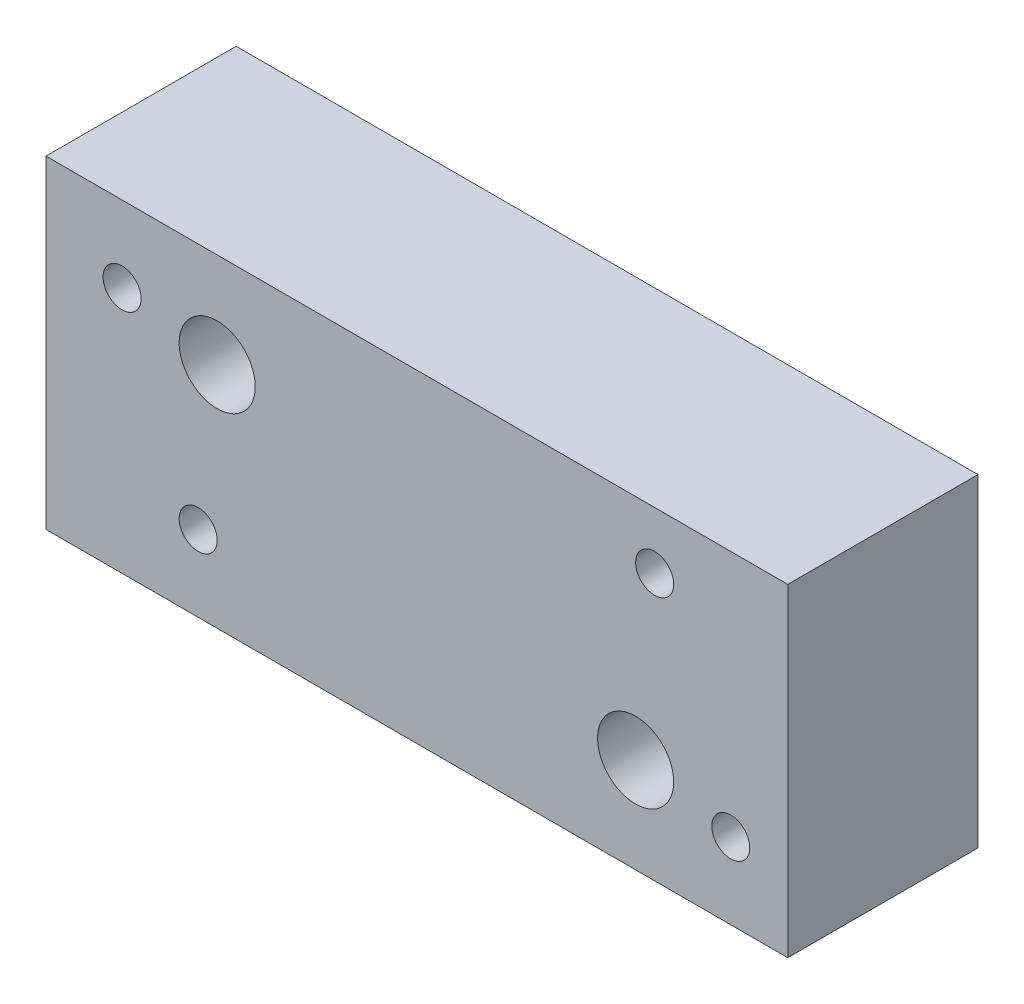
ISO-10303-21;
HEADER;
FILE_DESCRIPTION(('STEP AP214'),'2;1');
FILE_NAME('part.step','',(''),(''),'','','');
FILE_SCHEMA(('AUTOMOTIVE_DESIGN { 1 0 10303 214 1 1 1 1 }'));
ENDSEC;
DATA;
#1=APPLICATION_CONTEXT('core data for automotive mechanical design processes');
#2=APPLICATION_PROTOCOL_DEFINITION('international standard','automotive_design',2000,#1);
#3=PRODUCT_CONTEXT('',#1,'mechanical');
#4=PRODUCT('Part','Part','',(#3));
#5=PRODUCT_RELATED_PRODUCT_CATEGORY('part','',(#4));
#6=PRODUCT_DEFINITION_FORMATION('','',#4);
#7=PRODUCT_DEFINITION_CONTEXT('part definition',#1,'design');
#8=PRODUCT_DEFINITION('design','',#6,#7);
#9=PRODUCT_DEFINITION_SHAPE('','',#8);
#10=(LENGTH_UNIT() NAMED_UNIT(*) SI_UNIT(.MILLI.,.METRE.));
#11=(NAMED_UNIT(*) PLANE_ANGLE_UNIT() SI_UNIT($,.RADIAN.));
#12=(NAMED_UNIT(*) SI_UNIT($,.STERADIAN.) SOLID_ANGLE_UNIT());
#13=UNCERTAINTY_MEASURE_WITH_UNIT(LENGTH_MEASURE(1.E-05),#10,'distance_accuracy_value','');
#14=(GEOMETRIC_REPRESENTATION_CONTEXT(3) GLOBAL_UNCERTAINTY_ASSIGNED_CONTEXT((#13)) GLOBAL_UNIT_ASSIGNED_CONTEXT((#10,
#11,#12)) REPRESENTATION_CONTEXT('',''));
#15=CARTESIAN_POINT('',(0.,0.,0.));
#16=DIRECTION('',(0.,0.,1.));
#17=DIRECTION('',(1.,0.,0.));
#18=AXIS2_PLACEMENT_3D('',#15,#16,#17);
#19=CARTESIAN_POINT('',(0.,0.,5.));
#20=DIRECTION('',(0.,0.,1.));
#21=DIRECTION('',(1.,0.,0.));
#22=AXIS2_PLACEMENT_3D('',#19,#20,#21);
#23=PLANE('',#22);
#24=CARTESIAN_POINT('',(12.5,5.5,5.));
#25=DIRECTION('',(0.,0.,1.));
#26=DIRECTION('',(1.,0.,0.));
#27=AXIS2_PLACEMENT_3D('',#24,#25,#26);
#28=CIRCLE('',#27,1.);
#29=CARTESIAN_POINT('',(13.5,5.5,5.));
#30=VERTEX_POINT('',#29);
#31=EDGE_CURVE('E162',#30,#30,#28,.T.);
#32=ORIENTED_EDGE('',*,*,#31,.F.);
#33=EDGE_LOOP('',(#32));
#34=FACE_BOUND('',#33,.T.);
#35=CARTESIAN_POINT('',(-11.5,-4.5,5.));
#36=DIRECTION('',(0.,0.,1.));
#37=DIRECTION('',(1.,0.,0.));
#38=AXIS2_PLACEMENT_3D('',#35,#36,#37);
#39=CIRCLE('',#38,1.);
#40=CARTESIAN_POINT('',(-10.5,-4.5,5.));
#41=VERTEX_POINT('',#40);
#42=EDGE_CURVE('E146',#41,#41,#39,.T.);
#43=ORIENTED_EDGE('',*,*,#42,.F.);
#44=EDGE_LOOP('',(#43));
#45=FACE_BOUND('',#44,.T.);
#46=CARTESIAN_POINT('',(-10.5,3.5,5.));
#47=DIRECTION('',(0.,0.,1.));
#48=DIRECTION('',(1.,0.,0.));
#49=AXIS2_PLACEMENT_3D('',#46,#47,#48);
#50=CIRCLE('',#49,2.);
#51=CARTESIAN_POINT('',(-8.50000000000001,3.5,5.));
#52=VERTEX_POINT('',#51);
#53=EDGE_CURVE('E116',#52,#52,#50,.T.);
#54=ORIENTED_EDGE('',*,*,#53,.F.);
#55=EDGE_LOOP('',(#54));
#56=FACE_BOUND('',#55,.T.);
#57=DIRECTION('',(0.,-1.,0.));
#58=VECTOR('',#57,1.);
#59=CARTESIAN_POINT('',(-19.5,-8.5,5.));
#60=LINE('',#59,#58);
#61=CARTESIAN_POINT('',(-19.5,8.5,5.));
#62=VERTEX_POINT('',#61);
#63=CARTESIAN_POINT('',(-19.5,-8.5,5.));
#64=VERTEX_POINT('',#63);
#65=EDGE_CURVE('E96',#62,#64,#60,.T.);
#66=ORIENTED_EDGE('',*,*,#65,.T.);
#67=DIRECTION('',(1.,0.,0.));
#68=VECTOR('',#67,1.);
#69=CARTESIAN_POINT('',(19.5,-8.5,5.));
#70=LINE('',#69,#68);
#71=CARTESIAN_POINT('',(19.5,-8.5,5.));
#72=VERTEX_POINT('',#71);
#73=EDGE_CURVE('E91',#64,#72,#70,.T.);
#74=ORIENTED_EDGE('',*,*,#73,.T.);
#75=DIRECTION('',(0.,1.,0.));
#76=VECTOR('',#75,1.);
#77=CARTESIAN_POINT('',(19.5,-8.5,5.));
#78=LINE('',#77,#76);
#79=CARTESIAN_POINT('',(19.5,8.5,5.));
#80=VERTEX_POINT('',#79);
#81=EDGE_CURVE('E94',#72,#80,#78,.T.);
#82=ORIENTED_EDGE('',*,*,#81,.T.);
#83=DIRECTION('',(-1.,0.,0.));
#84=VECTOR('',#83,1.);
#85=CARTESIAN_POINT('',(19.5,8.5,5.));
#86=LINE('',#85,#84);
#87=EDGE_CURVE('E61',#80,#62,#86,.T.);
#88=ORIENTED_EDGE('',*,*,#87,.T.);
#89=EDGE_LOOP('',(#66,#74,#82,#88));
#90=FACE_BOUND('',#89,.T.);
#91=CARTESIAN_POINT('',(-15.5,4.5,5.));
#92=DIRECTION('',(0.,0.,1.));
#93=DIRECTION('',(1.,0.,0.));
#94=AXIS2_PLACEMENT_3D('',#91,#92,#93);
#95=CIRCLE('',#94,1.);
#96=CARTESIAN_POINT('',(-14.5,4.5,5.));
#97=VERTEX_POINT('',#96);
#98=EDGE_CURVE('E138',#97,#97,#95,.T.);
#99=ORIENTED_EDGE('',*,*,#98,.F.);
#100=EDGE_LOOP('',(#99));
#101=FACE_BOUND('',#100,.T.);
#102=CARTESIAN_POINT('',(11.5,-3.5,5.));
#103=DIRECTION('',(0.,0.,1.));
#104=DIRECTION('',(1.,0.,0.));
#105=AXIS2_PLACEMENT_3D('',#102,#103,#104);
#106=CIRCLE('',#105,2.);
#107=CARTESIAN_POINT('',(13.5,-3.5,5.));
#108=VERTEX_POINT('',#107);
#109=EDGE_CURVE('E154',#108,#108,#106,.T.);
#110=ORIENTED_EDGE('',*,*,#109,.F.);
#111=EDGE_LOOP('',(#110));
#112=FACE_BOUND('',#111,.T.);
#113=CARTESIAN_POINT('',(16.5,-4.5,5.));
#114=DIRECTION('',(0.,0.,1.));
#115=DIRECTION('',(1.,0.,0.));
#116=AXIS2_PLACEMENT_3D('',#113,#114,#115);
#117=CIRCLE('',#116,1.);
#118=CARTESIAN_POINT('',(17.5,-4.5,5.));
#119=VERTEX_POINT('',#118);
#120=EDGE_CURVE('E170',#119,#119,#117,.T.);
#121=ORIENTED_EDGE('',*,*,#120,.F.);
#122=EDGE_LOOP('',(#121));
#123=FACE_BOUND('',#122,.T.);
#124=ADVANCED_FACE('F43',(#34,#45,#56,#90,#101,#112,#123),#23,.T.);
#125=CARTESIAN_POINT('',(0.,0.,-5.));
#126=DIRECTION('',(0.,0.,1.));
#127=DIRECTION('',(1.,0.,0.));
#128=AXIS2_PLACEMENT_3D('',#125,#126,#127);
#129=PLANE('',#128);
#130=DIRECTION('',(0.,-1.,0.));
#131=VECTOR('',#130,1.);
#132=CARTESIAN_POINT('',(-19.5,-8.5,-5.));
#133=LINE('',#132,#131);
#134=CARTESIAN_POINT('',(-19.5,8.5,-5.));
#135=VERTEX_POINT('',#134);
#136=CARTESIAN_POINT('',(-19.5,-8.5,-5.));
#137=VERTEX_POINT('',#136);
#138=EDGE_CURVE('E112',#135,#137,#133,.T.);
#139=ORIENTED_EDGE('',*,*,#138,.F.);
#140=DIRECTION('',(-1.,0.,0.));
#141=VECTOR('',#140,1.);
#142=CARTESIAN_POINT('',(19.5,8.5,-5.));
#143=LINE('',#142,#141);
#144=CARTESIAN_POINT('',(19.5,8.5,-5.));
#145=VERTEX_POINT('',#144);
#146=EDGE_CURVE('E84',#145,#135,#143,.T.);
#147=ORIENTED_EDGE('',*,*,#146,.F.);
#148=DIRECTION('',(0.,1.,0.));
#149=VECTOR('',#148,1.);
#150=CARTESIAN_POINT('',(19.5,-8.5,-5.));
#151=LINE('',#150,#149);
#152=CARTESIAN_POINT('',(19.5,-8.5,-5.));
#153=VERTEX_POINT('',#152);
#154=EDGE_CURVE('E78',#153,#145,#151,.T.);
#155=ORIENTED_EDGE('',*,*,#154,.F.);
#156=DIRECTION('',(1.,0.,0.));
#157=VECTOR('',#156,1.);
#158=CARTESIAN_POINT('',(19.5,-8.5,-5.));
#159=LINE('',#158,#157);
#160=EDGE_CURVE('E101',#137,#153,#159,.T.);
#161=ORIENTED_EDGE('',*,*,#160,.F.);
#162=EDGE_LOOP('',(#139,#147,#155,#161));
#163=FACE_BOUND('',#162,.T.);
#164=CARTESIAN_POINT('',(-10.5,3.5,-5.));
#165=DIRECTION('',(0.,0.,1.));
#166=DIRECTION('',(1.,0.,0.));
#167=AXIS2_PLACEMENT_3D('',#164,#165,#166);
#168=CIRCLE('',#167,2.);
#169=CARTESIAN_POINT('',(-8.50000000000001,3.5,-5.));
#170=VERTEX_POINT('',#169);
#171=EDGE_CURVE('E134',#170,#170,#168,.T.);
#172=ORIENTED_EDGE('',*,*,#171,.T.);
#173=EDGE_LOOP('',(#172));
#174=FACE_BOUND('',#173,.T.);
#175=CARTESIAN_POINT('',(-15.5,4.5,-5.));
#176=DIRECTION('',(0.,0.,1.));
#177=DIRECTION('',(1.,0.,0.));
#178=AXIS2_PLACEMENT_3D('',#175,#176,#177);
#179=CIRCLE('',#178,1.);
#180=CARTESIAN_POINT('',(-14.5,4.5,-5.));
#181=VERTEX_POINT('',#180);
#182=EDGE_CURVE('E142',#181,#181,#179,.T.);
#183=ORIENTED_EDGE('',*,*,#182,.T.);
#184=EDGE_LOOP('',(#183));
#185=FACE_BOUND('',#184,.T.);
#186=CARTESIAN_POINT('',(-11.5,-4.5,-5.));
#187=DIRECTION('',(0.,0.,1.));
#188=DIRECTION('',(1.,0.,0.));
#189=AXIS2_PLACEMENT_3D('',#186,#187,#188);
#190=CIRCLE('',#189,1.);
#191=CARTESIAN_POINT('',(-10.5,-4.5,-5.));
#192=VERTEX_POINT('',#191);
#193=EDGE_CURVE('E150',#192,#192,#190,.T.);
#194=ORIENTED_EDGE('',*,*,#193,.T.);
#195=EDGE_LOOP('',(#194));
#196=FACE_BOUND('',#195,.T.);
#197=CARTESIAN_POINT('',(11.5,-3.5,-5.));
#198=DIRECTION('',(0.,0.,1.));
#199=DIRECTION('',(1.,0.,0.));
#200=AXIS2_PLACEMENT_3D('',#197,#198,#199);
#201=CIRCLE('',#200,2.);
#202=CARTESIAN_POINT('',(13.5,-3.5,-5.));
#203=VERTEX_POINT('',#202);
#204=EDGE_CURVE('E158',#203,#203,#201,.T.);
#205=ORIENTED_EDGE('',*,*,#204,.T.);
#206=EDGE_LOOP('',(#205));
#207=FACE_BOUND('',#206,.T.);
#208=CARTESIAN_POINT('',(12.5,5.5,-5.));
#209=DIRECTION('',(0.,0.,1.));
#210=DIRECTION('',(1.,0.,0.));
#211=AXIS2_PLACEMENT_3D('',#208,#209,#210);
#212=CIRCLE('',#211,1.);
#213=CARTESIAN_POINT('',(13.5,5.5,-5.));
#214=VERTEX_POINT('',#213);
#215=EDGE_CURVE('E166',#214,#214,#212,.T.);
#216=ORIENTED_EDGE('',*,*,#215,.T.);
#217=EDGE_LOOP('',(#216));
#218=FACE_BOUND('',#217,.T.);
#219=CARTESIAN_POINT('',(16.5,-4.5,-5.));
#220=DIRECTION('',(0.,0.,1.));
#221=DIRECTION('',(1.,0.,0.));
#222=AXIS2_PLACEMENT_3D('',#219,#220,#221);
#223=CIRCLE('',#222,1.);
#224=CARTESIAN_POINT('',(17.5,-4.5,-5.));
#225=VERTEX_POINT('',#224);
#226=EDGE_CURVE('E174',#225,#225,#223,.T.);
#227=ORIENTED_EDGE('',*,*,#226,.T.);
#228=EDGE_LOOP('',(#227));
#229=FACE_BOUND('',#228,.T.);
#230=ADVANCED_FACE('F129',(#163,#174,#185,#196,#207,#218,#229),#129,.F.);
#231=CARTESIAN_POINT('',(-19.5,-8.5,5.));
#232=DIRECTION('',(1.,0.,0.));
#233=DIRECTION('',(0.,0.,-1.));
#234=AXIS2_PLACEMENT_3D('',#231,#232,#233);
#235=PLANE('',#234);
#236=ORIENTED_EDGE('',*,*,#138,.T.);
#237=DIRECTION('',(0.,0.,-1.));
#238=VECTOR('',#237,1.);
#239=CARTESIAN_POINT('',(-19.5,-8.5,5.));
#240=LINE('',#239,#238);
#241=EDGE_CURVE('E11',#64,#137,#240,.T.);
#242=ORIENTED_EDGE('',*,*,#241,.F.);
#243=ORIENTED_EDGE('',*,*,#65,.F.);
#244=DIRECTION('',(0.,0.,-1.));
#245=VECTOR('',#244,1.);
#246=CARTESIAN_POINT('',(-19.5,8.5,5.));
#247=LINE('',#246,#245);
#248=EDGE_CURVE('E108',#62,#135,#247,.T.);
#249=ORIENTED_EDGE('',*,*,#248,.T.);
#250=EDGE_LOOP('',(#236,#242,#243,#249));
#251=FACE_BOUND('',#250,.T.);
#252=ADVANCED_FACE('F45',(#251),#235,.F.);
#253=CARTESIAN_POINT('',(19.5,-8.5,5.));
#254=DIRECTION('',(0.,1.,0.));
#255=DIRECTION('',(-1.,0.,0.));
#256=AXIS2_PLACEMENT_3D('',#253,#254,#255);
#257=PLANE('',#256);
#258=ORIENTED_EDGE('',*,*,#160,.T.);
#259=DIRECTION('',(0.,0.,-1.));
#260=VECTOR('',#259,1.);
#261=CARTESIAN_POINT('',(19.5,-8.5,5.));
#262=LINE('',#261,#260);
#263=EDGE_CURVE('E53',#72,#153,#262,.T.);
#264=ORIENTED_EDGE('',*,*,#263,.F.);
#265=ORIENTED_EDGE('',*,*,#73,.F.);
#266=ORIENTED_EDGE('',*,*,#241,.T.);
#267=EDGE_LOOP('',(#258,#264,#265,#266));
#268=FACE_BOUND('',#267,.T.);
#269=ADVANCED_FACE('F100',(#268),#257,.F.);
#270=CARTESIAN_POINT('',(19.5,-8.5,5.));
#271=DIRECTION('',(-1.,0.,0.));
#272=DIRECTION('',(0.,0.,1.));
#273=AXIS2_PLACEMENT_3D('',#270,#271,#272);
#274=PLANE('',#273);
#275=ORIENTED_EDGE('',*,*,#154,.T.);
#276=DIRECTION('',(0.,0.,-1.));
#277=VECTOR('',#276,1.);
#278=CARTESIAN_POINT('',(19.5,8.5,5.));
#279=LINE('',#278,#277);
#280=EDGE_CURVE('E103',#80,#145,#279,.T.);
#281=ORIENTED_EDGE('',*,*,#280,.F.);
#282=ORIENTED_EDGE('',*,*,#81,.F.);
#283=ORIENTED_EDGE('',*,*,#263,.T.);
#284=EDGE_LOOP('',(#275,#281,#282,#283));
#285=FACE_BOUND('',#284,.T.);
#286=ADVANCED_FACE('F104',(#285),#274,.F.);
#287=CARTESIAN_POINT('',(19.5,8.5,5.));
#288=DIRECTION('',(0.,-1.,0.));
#289=DIRECTION('',(1.,0.,0.));
#290=AXIS2_PLACEMENT_3D('',#287,#288,#289);
#291=PLANE('',#290);
#292=ORIENTED_EDGE('',*,*,#146,.T.);
#293=ORIENTED_EDGE('',*,*,#248,.F.);
#294=ORIENTED_EDGE('',*,*,#87,.F.);
#295=ORIENTED_EDGE('',*,*,#280,.T.);
#296=EDGE_LOOP('',(#292,#293,#294,#295));
#297=FACE_BOUND('',#296,.T.);
#298=ADVANCED_FACE('F126',(#297),#291,.F.);
#299=CARTESIAN_POINT('',(-10.5,3.5,5.));
#300=DIRECTION('',(0.,0.,-1.));
#301=DIRECTION('',(-1.,0.,0.));
#302=AXIS2_PLACEMENT_3D('',#299,#300,#301);
#303=CYLINDRICAL_SURFACE('',#302,2.);
#304=ORIENTED_EDGE('',*,*,#53,.T.);
#305=EDGE_LOOP('',(#304));
#306=FACE_BOUND('',#305,.T.);
#307=ORIENTED_EDGE('',*,*,#171,.F.);
#308=EDGE_LOOP('',(#307));
#309=FACE_BOUND('',#308,.T.);
#310=ADVANCED_FACE('F195',(#306,#309),#303,.F.);
#311=CARTESIAN_POINT('',(-15.5,4.5,5.));
#312=DIRECTION('',(0.,0.,-1.));
#313=DIRECTION('',(-1.,0.,0.));
#314=AXIS2_PLACEMENT_3D('',#311,#312,#313);
#315=CYLINDRICAL_SURFACE('',#314,1.);
#316=ORIENTED_EDGE('',*,*,#98,.T.);
#317=EDGE_LOOP('',(#316));
#318=FACE_BOUND('',#317,.T.);
#319=ORIENTED_EDGE('',*,*,#182,.F.);
#320=EDGE_LOOP('',(#319));
#321=FACE_BOUND('',#320,.T.);
#322=ADVANCED_FACE('F249',(#318,#321),#315,.F.);
#323=CARTESIAN_POINT('',(-11.5,-4.5,5.));
#324=DIRECTION('',(0.,0.,-1.));
#325=DIRECTION('',(-1.,0.,0.));
#326=AXIS2_PLACEMENT_3D('',#323,#324,#325);
#327=CYLINDRICAL_SURFACE('',#326,1.);
#328=ORIENTED_EDGE('',*,*,#42,.T.);
#329=EDGE_LOOP('',(#328));
#330=FACE_BOUND('',#329,.T.);
#331=ORIENTED_EDGE('',*,*,#193,.F.);
#332=EDGE_LOOP('',(#331));
#333=FACE_BOUND('',#332,.T.);
#334=ADVANCED_FACE('F258',(#330,#333),#327,.F.);
#335=CARTESIAN_POINT('',(11.5,-3.5,5.));
#336=DIRECTION('',(0.,0.,-1.));
#337=DIRECTION('',(-1.,0.,0.));
#338=AXIS2_PLACEMENT_3D('',#335,#336,#337);
#339=CYLINDRICAL_SURFACE('',#338,2.);
#340=ORIENTED_EDGE('',*,*,#109,.T.);
#341=EDGE_LOOP('',(#340));
#342=FACE_BOUND('',#341,.T.);
#343=ORIENTED_EDGE('',*,*,#204,.F.);
#344=EDGE_LOOP('',(#343));
#345=FACE_BOUND('',#344,.T.);
#346=ADVANCED_FACE('F267',(#342,#345),#339,.F.);
#347=CARTESIAN_POINT('',(12.5,5.5,5.));
#348=DIRECTION('',(0.,0.,-1.));
#349=DIRECTION('',(-1.,0.,0.));
#350=AXIS2_PLACEMENT_3D('',#347,#348,#349);
#351=CYLINDRICAL_SURFACE('',#350,1.);
#352=ORIENTED_EDGE('',*,*,#31,.T.);
#353=EDGE_LOOP('',(#352));
#354=FACE_BOUND('',#353,.T.);
#355=ORIENTED_EDGE('',*,*,#215,.F.);
#356=EDGE_LOOP('',(#355));
#357=FACE_BOUND('',#356,.T.);
#358=ADVANCED_FACE('F277',(#354,#357),#351,.F.);
#359=CARTESIAN_POINT('',(16.5,-4.5,5.));
#360=DIRECTION('',(0.,0.,-1.));
#361=DIRECTION('',(-1.,0.,0.));
#362=AXIS2_PLACEMENT_3D('',#359,#360,#361);
#363=CYLINDRICAL_SURFACE('',#362,1.);
#364=ORIENTED_EDGE('',*,*,#120,.T.);
#365=EDGE_LOOP('',(#364));
#366=FACE_BOUND('',#365,.T.);
#367=ORIENTED_EDGE('',*,*,#226,.F.);
#368=EDGE_LOOP('',(#367));
#369=FACE_BOUND('',#368,.T.);
#370=ADVANCED_FACE('F182',(#366,#369),#363,.F.);
#371=CLOSED_SHELL('',(#124,#230,#252,#269,#286,#298,#310,#322,#334,#346,#358,#370));
#372=MANIFOLD_SOLID_BREP('B2',#371);
#373=ADVANCED_BREP_SHAPE_REPRESENTATION('',(#18,#372),#14);
#374=SHAPE_DEFINITION_REPRESENTATION(#9,#373);
ENDSEC;
END-ISO-10303-21;
